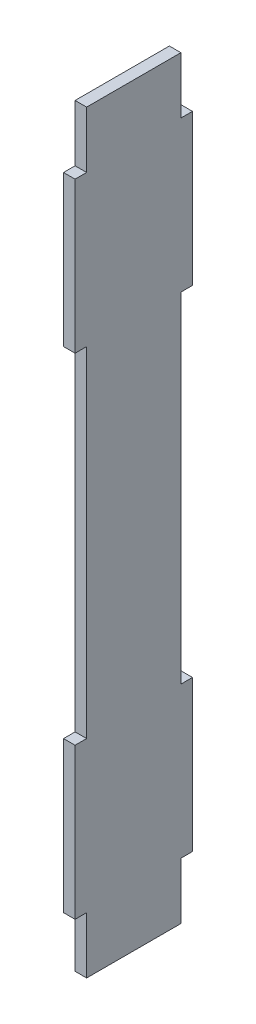
ISO-10303-21;
HEADER;
FILE_DESCRIPTION(('STEP AP214'),'2;1');
FILE_NAME('part.step','',(''),(''),'','','');
FILE_SCHEMA(('AUTOMOTIVE_DESIGN { 1 0 10303 214 1 1 1 1 }'));
ENDSEC;
DATA;
#1=APPLICATION_CONTEXT('core data for automotive mechanical design processes');
#2=APPLICATION_PROTOCOL_DEFINITION('international standard','automotive_design',2000,#1);
#3=PRODUCT_CONTEXT('',#1,'mechanical');
#4=PRODUCT('Part','Part','',(#3));
#5=PRODUCT_RELATED_PRODUCT_CATEGORY('part','',(#4));
#6=PRODUCT_DEFINITION_FORMATION('','',#4);
#7=PRODUCT_DEFINITION_CONTEXT('part definition',#1,'design');
#8=PRODUCT_DEFINITION('design','',#6,#7);
#9=PRODUCT_DEFINITION_SHAPE('','',#8);
#10=(LENGTH_UNIT() NAMED_UNIT(*) SI_UNIT(.MILLI.,.METRE.));
#11=(NAMED_UNIT(*) PLANE_ANGLE_UNIT() SI_UNIT($,.RADIAN.));
#12=(NAMED_UNIT(*) SI_UNIT($,.STERADIAN.) SOLID_ANGLE_UNIT());
#13=UNCERTAINTY_MEASURE_WITH_UNIT(LENGTH_MEASURE(1.E-05),#10,'distance_accuracy_value','');
#14=(GEOMETRIC_REPRESENTATION_CONTEXT(3) GLOBAL_UNCERTAINTY_ASSIGNED_CONTEXT((#13)) GLOBAL_UNIT_ASSIGNED_CONTEXT((#10,
#11,#12)) REPRESENTATION_CONTEXT('',''));
#15=CARTESIAN_POINT('',(0.,0.,0.));
#16=DIRECTION('',(0.,0.,1.));
#17=DIRECTION('',(1.,0.,0.));
#18=AXIS2_PLACEMENT_3D('',#15,#16,#17);
#19=CARTESIAN_POINT('',(-59.98,130.,-4.07));
#20=DIRECTION('',(0.,0.,-1.));
#21=DIRECTION('',(1.,0.,0.));
#22=AXIS2_PLACEMENT_3D('',#19,#20,#21);
#23=PLANE('',#22);
#24=DIRECTION('',(0.,-1.,0.));
#25=VECTOR('',#24,1.);
#26=CARTESIAN_POINT('',(-56.92,130.,-4.07));
#27=LINE('',#26,#25);
#28=CARTESIAN_POINT('',(-56.92,130.,-4.07));
#29=VERTEX_POINT('',#28);
#30=CARTESIAN_POINT('',(-56.92,114.99,-4.07));
#31=VERTEX_POINT('',#30);
#32=EDGE_CURVE('E211',#29,#31,#27,.T.);
#33=ORIENTED_EDGE('',*,*,#32,.F.);
#34=DIRECTION('',(1.,0.,0.));
#35=VECTOR('',#34,1.);
#36=CARTESIAN_POINT('',(-59.98,130.,-4.07));
#37=LINE('',#36,#35);
#38=CARTESIAN_POINT('',(-59.98,130.,-4.07));
#39=VERTEX_POINT('',#38);
#40=EDGE_CURVE('E210',#39,#29,#37,.T.);
#41=ORIENTED_EDGE('',*,*,#40,.F.);
#42=DIRECTION('',(0.,-1.,0.));
#43=VECTOR('',#42,1.);
#44=CARTESIAN_POINT('',(-59.98,130.,-4.07));
#45=LINE('',#44,#43);
#46=CARTESIAN_POINT('',(-59.98,114.99,-4.07));
#47=VERTEX_POINT('',#46);
#48=EDGE_CURVE('E265',#39,#47,#45,.T.);
#49=ORIENTED_EDGE('',*,*,#48,.T.);
#50=DIRECTION('',(1.,0.,0.));
#51=VECTOR('',#50,1.);
#52=CARTESIAN_POINT('',(-59.98,114.99,-4.07));
#53=LINE('',#52,#51);
#54=EDGE_CURVE('E11',#47,#31,#53,.T.);
#55=ORIENTED_EDGE('',*,*,#54,.T.);
#56=EDGE_LOOP('',(#33,#41,#49,#55));
#57=FACE_BOUND('',#56,.T.);
#58=ADVANCED_FACE('F43',(#57),#23,.F.);
#59=CARTESIAN_POINT('',(-59.98,114.99,-4.07));
#60=DIRECTION('',(0.,-1.,0.));
#61=DIRECTION('',(-1.,0.,0.));
#62=AXIS2_PLACEMENT_3D('',#59,#60,#61);
#63=PLANE('',#62);
#64=DIRECTION('',(0.,0.,1.));
#65=VECTOR('',#64,1.);
#66=CARTESIAN_POINT('',(-56.92,114.99,-4.07));
#67=LINE('',#66,#65);
#68=CARTESIAN_POINT('',(-56.92,114.99,-1.));
#69=VERTEX_POINT('',#68);
#70=EDGE_CURVE('E213',#31,#69,#67,.T.);
#71=ORIENTED_EDGE('',*,*,#70,.F.);
#72=ORIENTED_EDGE('',*,*,#54,.F.);
#73=DIRECTION('',(0.,0.,1.));
#74=VECTOR('',#73,1.);
#75=CARTESIAN_POINT('',(-59.98,114.99,-4.07));
#76=LINE('',#75,#74);
#77=CARTESIAN_POINT('',(-59.98,114.99,-1.));
#78=VERTEX_POINT('',#77);
#79=EDGE_CURVE('E133',#47,#78,#76,.T.);
#80=ORIENTED_EDGE('',*,*,#79,.T.);
#81=DIRECTION('',(1.,0.,0.));
#82=VECTOR('',#81,1.);
#83=CARTESIAN_POINT('',(-59.98,114.99,-1.));
#84=LINE('',#83,#82);
#85=EDGE_CURVE('E51',#78,#69,#84,.T.);
#86=ORIENTED_EDGE('',*,*,#85,.T.);
#87=EDGE_LOOP('',(#71,#72,#80,#86));
#88=FACE_BOUND('',#87,.T.);
#89=ADVANCED_FACE('F313',(#88),#63,.F.);
#90=CARTESIAN_POINT('',(-59.98,114.99,-1.));
#91=DIRECTION('',(0.,0.,-1.));
#92=DIRECTION('',(1.,0.,0.));
#93=AXIS2_PLACEMENT_3D('',#90,#91,#92);
#94=PLANE('',#93);
#95=DIRECTION('',(0.,-1.,0.));
#96=VECTOR('',#95,1.);
#97=CARTESIAN_POINT('',(-56.92,114.99,-1.));
#98=LINE('',#97,#96);
#99=CARTESIAN_POINT('',(-56.92,75.01,-1.));
#100=VERTEX_POINT('',#99);
#101=EDGE_CURVE('E216',#69,#100,#98,.T.);
#102=ORIENTED_EDGE('',*,*,#101,.F.);
#103=ORIENTED_EDGE('',*,*,#85,.F.);
#104=DIRECTION('',(0.,-1.,0.));
#105=VECTOR('',#104,1.);
#106=CARTESIAN_POINT('',(-59.98,114.99,-1.));
#107=LINE('',#106,#105);
#108=CARTESIAN_POINT('',(-59.98,75.01,-1.));
#109=VERTEX_POINT('',#108);
#110=EDGE_CURVE('E322',#78,#109,#107,.T.);
#111=ORIENTED_EDGE('',*,*,#110,.T.);
#112=DIRECTION('',(1.,0.,0.));
#113=VECTOR('',#112,1.);
#114=CARTESIAN_POINT('',(-59.98,75.01,-1.));
#115=LINE('',#114,#113);
#116=EDGE_CURVE('E308',#109,#100,#115,.T.);
#117=ORIENTED_EDGE('',*,*,#116,.T.);
#118=EDGE_LOOP('',(#102,#103,#111,#117));
#119=FACE_BOUND('',#118,.T.);
#120=ADVANCED_FACE('F404',(#119),#94,.F.);
#121=CARTESIAN_POINT('',(-59.98,75.01,-1.));
#122=DIRECTION('',(0.,1.,0.));
#123=DIRECTION('',(1.,0.,0.));
#124=AXIS2_PLACEMENT_3D('',#121,#122,#123);
#125=PLANE('',#124);
#126=DIRECTION('',(0.,0.,-1.));
#127=VECTOR('',#126,1.);
#128=CARTESIAN_POINT('',(-56.92,75.01,-1.));
#129=LINE('',#128,#127);
#130=CARTESIAN_POINT('',(-56.92,75.01,-4.07));
#131=VERTEX_POINT('',#130);
#132=EDGE_CURVE('E219',#100,#131,#129,.T.);
#133=ORIENTED_EDGE('',*,*,#132,.F.);
#134=ORIENTED_EDGE('',*,*,#116,.F.);
#135=DIRECTION('',(0.,0.,-1.));
#136=VECTOR('',#135,1.);
#137=CARTESIAN_POINT('',(-59.98,75.01,-1.));
#138=LINE('',#137,#136);
#139=CARTESIAN_POINT('',(-59.98,75.01,-4.07));
#140=VERTEX_POINT('',#139);
#141=EDGE_CURVE('E326',#109,#140,#138,.T.);
#142=ORIENTED_EDGE('',*,*,#141,.T.);
#143=DIRECTION('',(1.,0.,0.));
#144=VECTOR('',#143,1.);
#145=CARTESIAN_POINT('',(-59.98,75.01,-4.07));
#146=LINE('',#145,#144);
#147=EDGE_CURVE('E305',#140,#131,#146,.T.);
#148=ORIENTED_EDGE('',*,*,#147,.T.);
#149=EDGE_LOOP('',(#133,#134,#142,#148));
#150=FACE_BOUND('',#149,.T.);
#151=ADVANCED_FACE('F403',(#150),#125,.F.);
#152=CARTESIAN_POINT('',(-59.98,75.01,-4.07));
#153=DIRECTION('',(0.,0.,-1.));
#154=DIRECTION('',(0.,1.,0.));
#155=AXIS2_PLACEMENT_3D('',#152,#153,#154);
#156=PLANE('',#155);
#157=DIRECTION('',(0.,-1.,0.));
#158=VECTOR('',#157,1.);
#159=CARTESIAN_POINT('',(-56.92,75.01,-4.07));
#160=LINE('',#159,#158);
#161=CARTESIAN_POINT('',(-56.92,-15.01,-4.07000000000001));
#162=VERTEX_POINT('',#161);
#163=EDGE_CURVE('E222',#131,#162,#160,.T.);
#164=ORIENTED_EDGE('',*,*,#163,.F.);
#165=ORIENTED_EDGE('',*,*,#147,.F.);
#166=DIRECTION('',(0.,-1.,0.));
#167=VECTOR('',#166,1.);
#168=CARTESIAN_POINT('',(-59.98,75.01,-4.07));
#169=LINE('',#168,#167);
#170=CARTESIAN_POINT('',(-59.98,-15.01,-4.07000000000001));
#171=VERTEX_POINT('',#170);
#172=EDGE_CURVE('E329',#140,#171,#169,.T.);
#173=ORIENTED_EDGE('',*,*,#172,.T.);
#174=DIRECTION('',(1.,0.,0.));
#175=VECTOR('',#174,1.);
#176=CARTESIAN_POINT('',(-59.98,-15.01,-4.07000000000001));
#177=LINE('',#176,#175);
#178=EDGE_CURVE('E302',#171,#162,#177,.T.);
#179=ORIENTED_EDGE('',*,*,#178,.T.);
#180=EDGE_LOOP('',(#164,#165,#173,#179));
#181=FACE_BOUND('',#180,.T.);
#182=ADVANCED_FACE('F400',(#181),#156,.F.);
#183=CARTESIAN_POINT('',(-59.98,-15.01,-4.07000000000001));
#184=DIRECTION('',(0.,-1.,0.));
#185=DIRECTION('',(-1.,0.,0.));
#186=AXIS2_PLACEMENT_3D('',#183,#184,#185);
#187=PLANE('',#186);
#188=DIRECTION('',(0.,0.,1.));
#189=VECTOR('',#188,1.);
#190=CARTESIAN_POINT('',(-56.92,-15.01,-4.07000000000001));
#191=LINE('',#190,#189);
#192=CARTESIAN_POINT('',(-56.92,-15.01,-1.));
#193=VERTEX_POINT('',#192);
#194=EDGE_CURVE('E225',#162,#193,#191,.T.);
#195=ORIENTED_EDGE('',*,*,#194,.F.);
#196=ORIENTED_EDGE('',*,*,#178,.F.);
#197=DIRECTION('',(0.,0.,1.));
#198=VECTOR('',#197,1.);
#199=CARTESIAN_POINT('',(-59.98,-15.01,-4.07000000000001));
#200=LINE('',#199,#198);
#201=CARTESIAN_POINT('',(-59.98,-15.01,-1.));
#202=VERTEX_POINT('',#201);
#203=EDGE_CURVE('E332',#171,#202,#200,.T.);
#204=ORIENTED_EDGE('',*,*,#203,.T.);
#205=DIRECTION('',(1.,0.,0.));
#206=VECTOR('',#205,1.);
#207=CARTESIAN_POINT('',(-59.98,-15.01,-1.));
#208=LINE('',#207,#206);
#209=EDGE_CURVE('E299',#202,#193,#208,.T.);
#210=ORIENTED_EDGE('',*,*,#209,.T.);
#211=EDGE_LOOP('',(#195,#196,#204,#210));
#212=FACE_BOUND('',#211,.T.);
#213=ADVANCED_FACE('F397',(#212),#187,.F.);
#214=CARTESIAN_POINT('',(-59.98,-15.01,-1.));
#215=DIRECTION('',(0.,0.,-1.));
#216=DIRECTION('',(0.,1.,0.));
#217=AXIS2_PLACEMENT_3D('',#214,#215,#216);
#218=PLANE('',#217);
#219=DIRECTION('',(0.,-1.,0.));
#220=VECTOR('',#219,1.);
#221=CARTESIAN_POINT('',(-56.92,-15.01,-1.));
#222=LINE('',#221,#220);
#223=CARTESIAN_POINT('',(-56.92,-54.99,-1.));
#224=VERTEX_POINT('',#223);
#225=EDGE_CURVE('E228',#193,#224,#222,.T.);
#226=ORIENTED_EDGE('',*,*,#225,.F.);
#227=ORIENTED_EDGE('',*,*,#209,.F.);
#228=DIRECTION('',(0.,-1.,0.));
#229=VECTOR('',#228,1.);
#230=CARTESIAN_POINT('',(-59.98,-15.01,-1.));
#231=LINE('',#230,#229);
#232=CARTESIAN_POINT('',(-59.98,-54.99,-1.));
#233=VERTEX_POINT('',#232);
#234=EDGE_CURVE('E335',#202,#233,#231,.T.);
#235=ORIENTED_EDGE('',*,*,#234,.T.);
#236=DIRECTION('',(1.,0.,0.));
#237=VECTOR('',#236,1.);
#238=CARTESIAN_POINT('',(-59.98,-54.99,-1.));
#239=LINE('',#238,#237);
#240=EDGE_CURVE('E296',#233,#224,#239,.T.);
#241=ORIENTED_EDGE('',*,*,#240,.T.);
#242=EDGE_LOOP('',(#226,#227,#235,#241));
#243=FACE_BOUND('',#242,.T.);
#244=ADVANCED_FACE('F395',(#243),#218,.F.);
#245=CARTESIAN_POINT('',(-59.98,-54.99,-4.07000000000003));
#246=DIRECTION('',(0.,1.,0.));
#247=DIRECTION('',(1.,0.,0.));
#248=AXIS2_PLACEMENT_3D('',#245,#246,#247);
#249=PLANE('',#248);
#250=DIRECTION('',(0.,0.,-1.));
#251=VECTOR('',#250,1.);
#252=CARTESIAN_POINT('',(-56.92,-54.99,-4.07000000000003));
#253=LINE('',#252,#251);
#254=CARTESIAN_POINT('',(-56.92,-54.99,-4.07000000000003));
#255=VERTEX_POINT('',#254);
#256=EDGE_CURVE('E231',#224,#255,#253,.T.);
#257=ORIENTED_EDGE('',*,*,#256,.F.);
#258=ORIENTED_EDGE('',*,*,#240,.F.);
#259=DIRECTION('',(0.,0.,-1.));
#260=VECTOR('',#259,1.);
#261=CARTESIAN_POINT('',(-59.98,-54.99,-4.07000000000003));
#262=LINE('',#261,#260);
#263=CARTESIAN_POINT('',(-59.98,-54.99,-4.07000000000003));
#264=VERTEX_POINT('',#263);
#265=EDGE_CURVE('E338',#233,#264,#262,.T.);
#266=ORIENTED_EDGE('',*,*,#265,.T.);
#267=DIRECTION('',(1.,0.,0.));
#268=VECTOR('',#267,1.);
#269=CARTESIAN_POINT('',(-59.98,-54.99,-4.07000000000003));
#270=LINE('',#269,#268);
#271=EDGE_CURVE('E293',#264,#255,#270,.T.);
#272=ORIENTED_EDGE('',*,*,#271,.T.);
#273=EDGE_LOOP('',(#257,#258,#266,#272));
#274=FACE_BOUND('',#273,.T.);
#275=ADVANCED_FACE('F391',(#274),#249,.F.);
#276=CARTESIAN_POINT('',(-59.98,-54.99,-4.07000000000003));
#277=DIRECTION('',(0.,0.,-1.));
#278=DIRECTION('',(0.,1.,0.));
#279=AXIS2_PLACEMENT_3D('',#276,#277,#278);
#280=PLANE('',#279);
#281=DIRECTION('',(0.,-1.,0.));
#282=VECTOR('',#281,1.);
#283=CARTESIAN_POINT('',(-56.92,-54.99,-4.07000000000003));
#284=LINE('',#283,#282);
#285=CARTESIAN_POINT('',(-56.92,-70.,-4.07));
#286=VERTEX_POINT('',#285);
#287=EDGE_CURVE('E234',#255,#286,#284,.T.);
#288=ORIENTED_EDGE('',*,*,#287,.F.);
#289=ORIENTED_EDGE('',*,*,#271,.F.);
#290=DIRECTION('',(0.,-1.,0.));
#291=VECTOR('',#290,1.);
#292=CARTESIAN_POINT('',(-59.98,-54.99,-4.07000000000003));
#293=LINE('',#292,#291);
#294=CARTESIAN_POINT('',(-59.98,-70.,-4.07));
#295=VERTEX_POINT('',#294);
#296=EDGE_CURVE('E341',#264,#295,#293,.T.);
#297=ORIENTED_EDGE('',*,*,#296,.T.);
#298=DIRECTION('',(1.,0.,0.));
#299=VECTOR('',#298,1.);
#300=CARTESIAN_POINT('',(-59.98,-70.,-4.07));
#301=LINE('',#300,#299);
#302=EDGE_CURVE('E290',#295,#286,#301,.T.);
#303=ORIENTED_EDGE('',*,*,#302,.T.);
#304=EDGE_LOOP('',(#288,#289,#297,#303));
#305=FACE_BOUND('',#304,.T.);
#306=ADVANCED_FACE('F388',(#305),#280,.F.);
#307=CARTESIAN_POINT('',(-59.98,-70.,-4.07));
#308=DIRECTION('',(0.,1.,0.));
#309=DIRECTION('',(1.,0.,0.));
#310=AXIS2_PLACEMENT_3D('',#307,#308,#309);
#311=PLANE('',#310);
#312=DIRECTION('',(0.,0.,-1.));
#313=VECTOR('',#312,1.);
#314=CARTESIAN_POINT('',(-56.92,-70.,-4.07));
#315=LINE('',#314,#313);
#316=CARTESIAN_POINT('',(-56.92,-70.,-29.07));
#317=VERTEX_POINT('',#316);
#318=EDGE_CURVE('E237',#286,#317,#315,.T.);
#319=ORIENTED_EDGE('',*,*,#318,.F.);
#320=ORIENTED_EDGE('',*,*,#302,.F.);
#321=DIRECTION('',(0.,0.,-1.));
#322=VECTOR('',#321,1.);
#323=CARTESIAN_POINT('',(-59.98,-70.,-4.07));
#324=LINE('',#323,#322);
#325=CARTESIAN_POINT('',(-59.98,-70.,-29.07));
#326=VERTEX_POINT('',#325);
#327=EDGE_CURVE('E344',#295,#326,#324,.T.);
#328=ORIENTED_EDGE('',*,*,#327,.T.);
#329=DIRECTION('',(1.,0.,0.));
#330=VECTOR('',#329,1.);
#331=CARTESIAN_POINT('',(-59.98,-70.,-29.07));
#332=LINE('',#331,#330);
#333=EDGE_CURVE('E287',#326,#317,#332,.T.);
#334=ORIENTED_EDGE('',*,*,#333,.T.);
#335=EDGE_LOOP('',(#319,#320,#328,#334));
#336=FACE_BOUND('',#335,.T.);
#337=ADVANCED_FACE('F386',(#336),#311,.F.);
#338=CARTESIAN_POINT('',(-59.98,-70.,-29.07));
#339=DIRECTION('',(0.,0.,1.));
#340=DIRECTION('',(0.,-1.,0.));
#341=AXIS2_PLACEMENT_3D('',#338,#339,#340);
#342=PLANE('',#341);
#343=DIRECTION('',(0.,1.,0.));
#344=VECTOR('',#343,1.);
#345=CARTESIAN_POINT('',(-56.92,-70.,-29.07));
#346=LINE('',#345,#344);
#347=CARTESIAN_POINT('',(-56.92,-54.99,-29.07));
#348=VERTEX_POINT('',#347);
#349=EDGE_CURVE('E240',#317,#348,#346,.T.);
#350=ORIENTED_EDGE('',*,*,#349,.F.);
#351=ORIENTED_EDGE('',*,*,#333,.F.);
#352=DIRECTION('',(0.,1.,0.));
#353=VECTOR('',#352,1.);
#354=CARTESIAN_POINT('',(-59.98,-70.,-29.07));
#355=LINE('',#354,#353);
#356=CARTESIAN_POINT('',(-59.98,-54.99,-29.07));
#357=VERTEX_POINT('',#356);
#358=EDGE_CURVE('E347',#326,#357,#355,.T.);
#359=ORIENTED_EDGE('',*,*,#358,.T.);
#360=DIRECTION('',(1.,0.,0.));
#361=VECTOR('',#360,1.);
#362=CARTESIAN_POINT('',(-59.98,-54.99,-29.07));
#363=LINE('',#362,#361);
#364=EDGE_CURVE('E284',#357,#348,#363,.T.);
#365=ORIENTED_EDGE('',*,*,#364,.T.);
#366=EDGE_LOOP('',(#350,#351,#359,#365));
#367=FACE_BOUND('',#366,.T.);
#368=ADVANCED_FACE('F382',(#367),#342,.F.);
#369=CARTESIAN_POINT('',(-59.98,-54.99,-29.07));
#370=DIRECTION('',(0.,1.,0.));
#371=DIRECTION('',(1.,0.,0.));
#372=AXIS2_PLACEMENT_3D('',#369,#370,#371);
#373=PLANE('',#372);
#374=DIRECTION('',(0.,0.,-1.));
#375=VECTOR('',#374,1.);
#376=CARTESIAN_POINT('',(-56.92,-54.99,-29.07));
#377=LINE('',#376,#375);
#378=CARTESIAN_POINT('',(-56.92,-54.99,-32.14));
#379=VERTEX_POINT('',#378);
#380=EDGE_CURVE('E243',#348,#379,#377,.T.);
#381=ORIENTED_EDGE('',*,*,#380,.F.);
#382=ORIENTED_EDGE('',*,*,#364,.F.);
#383=DIRECTION('',(0.,0.,-1.));
#384=VECTOR('',#383,1.);
#385=CARTESIAN_POINT('',(-59.98,-54.99,-29.07));
#386=LINE('',#385,#384);
#387=CARTESIAN_POINT('',(-59.98,-54.99,-32.14));
#388=VERTEX_POINT('',#387);
#389=EDGE_CURVE('E350',#357,#388,#386,.T.);
#390=ORIENTED_EDGE('',*,*,#389,.T.);
#391=DIRECTION('',(1.,0.,0.));
#392=VECTOR('',#391,1.);
#393=CARTESIAN_POINT('',(-59.98,-54.99,-32.14));
#394=LINE('',#393,#392);
#395=EDGE_CURVE('E281',#388,#379,#394,.T.);
#396=ORIENTED_EDGE('',*,*,#395,.T.);
#397=EDGE_LOOP('',(#381,#382,#390,#396));
#398=FACE_BOUND('',#397,.T.);
#399=ADVANCED_FACE('F379',(#398),#373,.F.);
#400=CARTESIAN_POINT('',(-59.98,-15.01,-32.14));
#401=DIRECTION('',(0.,0.,1.));
#402=DIRECTION('',(-1.,0.,0.));
#403=AXIS2_PLACEMENT_3D('',#400,#401,#402);
#404=PLANE('',#403);
#405=DIRECTION('',(0.,1.,0.));
#406=VECTOR('',#405,1.);
#407=CARTESIAN_POINT('',(-56.92,-15.01,-32.14));
#408=LINE('',#407,#406);
#409=CARTESIAN_POINT('',(-56.92,-15.01,-32.14));
#410=VERTEX_POINT('',#409);
#411=EDGE_CURVE('E246',#379,#410,#408,.T.);
#412=ORIENTED_EDGE('',*,*,#411,.F.);
#413=ORIENTED_EDGE('',*,*,#395,.F.);
#414=DIRECTION('',(0.,1.,0.));
#415=VECTOR('',#414,1.);
#416=CARTESIAN_POINT('',(-59.98,-15.01,-32.14));
#417=LINE('',#416,#415);
#418=CARTESIAN_POINT('',(-59.98,-15.01,-32.14));
#419=VERTEX_POINT('',#418);
#420=EDGE_CURVE('E353',#388,#419,#417,.T.);
#421=ORIENTED_EDGE('',*,*,#420,.T.);
#422=DIRECTION('',(1.,0.,0.));
#423=VECTOR('',#422,1.);
#424=CARTESIAN_POINT('',(-59.98,-15.01,-32.14));
#425=LINE('',#424,#423);
#426=EDGE_CURVE('E278',#419,#410,#425,.T.);
#427=ORIENTED_EDGE('',*,*,#426,.T.);
#428=EDGE_LOOP('',(#412,#413,#421,#427));
#429=FACE_BOUND('',#428,.T.);
#430=ADVANCED_FACE('F377',(#429),#404,.F.);
#431=CARTESIAN_POINT('',(-59.98,-15.01,-29.07));
#432=DIRECTION('',(0.,-1.,0.));
#433=DIRECTION('',(-1.,0.,0.));
#434=AXIS2_PLACEMENT_3D('',#431,#432,#433);
#435=PLANE('',#434);
#436=DIRECTION('',(0.,0.,1.));
#437=VECTOR('',#436,1.);
#438=CARTESIAN_POINT('',(-56.92,-15.01,-29.07));
#439=LINE('',#438,#437);
#440=CARTESIAN_POINT('',(-56.92,-15.01,-29.07));
#441=VERTEX_POINT('',#440);
#442=EDGE_CURVE('E249',#410,#441,#439,.T.);
#443=ORIENTED_EDGE('',*,*,#442,.F.);
#444=ORIENTED_EDGE('',*,*,#426,.F.);
#445=DIRECTION('',(0.,0.,1.));
#446=VECTOR('',#445,1.);
#447=CARTESIAN_POINT('',(-59.98,-15.01,-29.07));
#448=LINE('',#447,#446);
#449=CARTESIAN_POINT('',(-59.98,-15.01,-29.07));
#450=VERTEX_POINT('',#449);
#451=EDGE_CURVE('E356',#419,#450,#448,.T.);
#452=ORIENTED_EDGE('',*,*,#451,.T.);
#453=DIRECTION('',(1.,0.,0.));
#454=VECTOR('',#453,1.);
#455=CARTESIAN_POINT('',(-59.98,-15.01,-29.07));
#456=LINE('',#455,#454);
#457=EDGE_CURVE('E275',#450,#441,#456,.T.);
#458=ORIENTED_EDGE('',*,*,#457,.T.);
#459=EDGE_LOOP('',(#443,#444,#452,#458));
#460=FACE_BOUND('',#459,.T.);
#461=ADVANCED_FACE('F373',(#460),#435,.F.);
#462=CARTESIAN_POINT('',(-59.98,-15.01,-29.07));
#463=DIRECTION('',(0.,0.,1.));
#464=DIRECTION('',(0.,-1.,0.));
#465=AXIS2_PLACEMENT_3D('',#462,#463,#464);
#466=PLANE('',#465);
#467=DIRECTION('',(0.,1.,0.));
#468=VECTOR('',#467,1.);
#469=CARTESIAN_POINT('',(-56.92,-15.01,-29.07));
#470=LINE('',#469,#468);
#471=CARTESIAN_POINT('',(-56.92,75.01,-29.07));
#472=VERTEX_POINT('',#471);
#473=EDGE_CURVE('E252',#441,#472,#470,.T.);
#474=ORIENTED_EDGE('',*,*,#473,.F.);
#475=ORIENTED_EDGE('',*,*,#457,.F.);
#476=DIRECTION('',(0.,1.,0.));
#477=VECTOR('',#476,1.);
#478=CARTESIAN_POINT('',(-59.98,-15.01,-29.07));
#479=LINE('',#478,#477);
#480=CARTESIAN_POINT('',(-59.98,75.01,-29.07));
#481=VERTEX_POINT('',#480);
#482=EDGE_CURVE('E359',#450,#481,#479,.T.);
#483=ORIENTED_EDGE('',*,*,#482,.T.);
#484=DIRECTION('',(1.,0.,0.));
#485=VECTOR('',#484,1.);
#486=CARTESIAN_POINT('',(-59.98,75.01,-29.07));
#487=LINE('',#486,#485);
#488=EDGE_CURVE('E272',#481,#472,#487,.T.);
#489=ORIENTED_EDGE('',*,*,#488,.T.);
#490=EDGE_LOOP('',(#474,#475,#483,#489));
#491=FACE_BOUND('',#490,.T.);
#492=ADVANCED_FACE('F370',(#491),#466,.F.);
#493=CARTESIAN_POINT('',(-59.98,75.01,-32.14));
#494=DIRECTION('',(0.,1.,0.));
#495=DIRECTION('',(1.,0.,0.));
#496=AXIS2_PLACEMENT_3D('',#493,#494,#495);
#497=PLANE('',#496);
#498=DIRECTION('',(0.,0.,-1.));
#499=VECTOR('',#498,1.);
#500=CARTESIAN_POINT('',(-56.92,75.01,-32.14));
#501=LINE('',#500,#499);
#502=CARTESIAN_POINT('',(-56.92,75.01,-32.14));
#503=VERTEX_POINT('',#502);
#504=EDGE_CURVE('E255',#472,#503,#501,.T.);
#505=ORIENTED_EDGE('',*,*,#504,.F.);
#506=ORIENTED_EDGE('',*,*,#488,.F.);
#507=DIRECTION('',(0.,0.,-1.));
#508=VECTOR('',#507,1.);
#509=CARTESIAN_POINT('',(-59.98,75.01,-32.14));
#510=LINE('',#509,#508);
#511=CARTESIAN_POINT('',(-59.98,75.01,-32.14));
#512=VERTEX_POINT('',#511);
#513=EDGE_CURVE('E205',#481,#512,#510,.T.);
#514=ORIENTED_EDGE('',*,*,#513,.T.);
#515=DIRECTION('',(1.,0.,0.));
#516=VECTOR('',#515,1.);
#517=CARTESIAN_POINT('',(-59.98,75.01,-32.14));
#518=LINE('',#517,#516);
#519=EDGE_CURVE('E269',#512,#503,#518,.T.);
#520=ORIENTED_EDGE('',*,*,#519,.T.);
#521=EDGE_LOOP('',(#505,#506,#514,#520));
#522=FACE_BOUND('',#521,.T.);
#523=ADVANCED_FACE('F364',(#522),#497,.F.);
#524=CARTESIAN_POINT('',(-59.98,114.99,-32.14));
#525=DIRECTION('',(0.,0.,1.));
#526=DIRECTION('',(-1.,0.,0.));
#527=AXIS2_PLACEMENT_3D('',#524,#525,#526);
#528=PLANE('',#527);
#529=DIRECTION('',(0.,1.,0.));
#530=VECTOR('',#529,1.);
#531=CARTESIAN_POINT('',(-56.92,114.99,-32.14));
#532=LINE('',#531,#530);
#533=CARTESIAN_POINT('',(-56.92,114.99,-32.14));
#534=VERTEX_POINT('',#533);
#535=EDGE_CURVE('E258',#503,#534,#532,.T.);
#536=ORIENTED_EDGE('',*,*,#535,.F.);
#537=ORIENTED_EDGE('',*,*,#519,.F.);
#538=DIRECTION('',(0.,1.,0.));
#539=VECTOR('',#538,1.);
#540=CARTESIAN_POINT('',(-59.98,114.99,-32.14));
#541=LINE('',#540,#539);
#542=CARTESIAN_POINT('',(-59.98,114.99,-32.14));
#543=VERTEX_POINT('',#542);
#544=EDGE_CURVE('E203',#512,#543,#541,.T.);
#545=ORIENTED_EDGE('',*,*,#544,.T.);
#546=DIRECTION('',(1.,0.,0.));
#547=VECTOR('',#546,1.);
#548=CARTESIAN_POINT('',(-59.98,114.99,-32.14));
#549=LINE('',#548,#547);
#550=EDGE_CURVE('E197',#543,#534,#549,.T.);
#551=ORIENTED_EDGE('',*,*,#550,.T.);
#552=EDGE_LOOP('',(#536,#537,#545,#551));
#553=FACE_BOUND('',#552,.T.);
#554=ADVANCED_FACE('F368',(#553),#528,.F.);
#555=CARTESIAN_POINT('',(-59.98,114.99,-29.07));
#556=DIRECTION('',(0.,-1.,0.));
#557=DIRECTION('',(-1.,0.,0.));
#558=AXIS2_PLACEMENT_3D('',#555,#556,#557);
#559=PLANE('',#558);
#560=DIRECTION('',(0.,0.,1.));
#561=VECTOR('',#560,1.);
#562=CARTESIAN_POINT('',(-56.92,114.99,-29.07));
#563=LINE('',#562,#561);
#564=CARTESIAN_POINT('',(-56.92,114.99,-29.07));
#565=VERTEX_POINT('',#564);
#566=EDGE_CURVE('E261',#534,#565,#563,.T.);
#567=ORIENTED_EDGE('',*,*,#566,.F.);
#568=ORIENTED_EDGE('',*,*,#550,.F.);
#569=DIRECTION('',(0.,0.,1.));
#570=VECTOR('',#569,1.);
#571=CARTESIAN_POINT('',(-59.98,114.99,-29.07));
#572=LINE('',#571,#570);
#573=CARTESIAN_POINT('',(-59.98,114.99,-29.07));
#574=VERTEX_POINT('',#573);
#575=EDGE_CURVE('E187',#543,#574,#572,.T.);
#576=ORIENTED_EDGE('',*,*,#575,.T.);
#577=DIRECTION('',(1.,0.,0.));
#578=VECTOR('',#577,1.);
#579=CARTESIAN_POINT('',(-59.98,114.99,-29.07));
#580=LINE('',#579,#578);
#581=EDGE_CURVE('E192',#574,#565,#580,.T.);
#582=ORIENTED_EDGE('',*,*,#581,.T.);
#583=EDGE_LOOP('',(#567,#568,#576,#582));
#584=FACE_BOUND('',#583,.T.);
#585=ADVANCED_FACE('F200',(#584),#559,.F.);
#586=CARTESIAN_POINT('',(-59.98,114.99,-29.07));
#587=DIRECTION('',(0.,0.,1.));
#588=DIRECTION('',(-1.,0.,0.));
#589=AXIS2_PLACEMENT_3D('',#586,#587,#588);
#590=PLANE('',#589);
#591=DIRECTION('',(0.,1.,0.));
#592=VECTOR('',#591,1.);
#593=CARTESIAN_POINT('',(-56.92,114.99,-29.07));
#594=LINE('',#593,#592);
#595=CARTESIAN_POINT('',(-56.92,130.,-29.07));
#596=VERTEX_POINT('',#595);
#597=EDGE_CURVE('E194',#565,#596,#594,.T.);
#598=ORIENTED_EDGE('',*,*,#597,.F.);
#599=ORIENTED_EDGE('',*,*,#581,.F.);
#600=DIRECTION('',(0.,1.,0.));
#601=VECTOR('',#600,1.);
#602=CARTESIAN_POINT('',(-59.98,114.99,-29.07));
#603=LINE('',#602,#601);
#604=CARTESIAN_POINT('',(-59.98,130.,-29.07));
#605=VERTEX_POINT('',#604);
#606=EDGE_CURVE('E183',#574,#605,#603,.T.);
#607=ORIENTED_EDGE('',*,*,#606,.T.);
#608=DIRECTION('',(1.,0.,0.));
#609=VECTOR('',#608,1.);
#610=CARTESIAN_POINT('',(-59.98,130.,-29.07));
#611=LINE('',#610,#609);
#612=EDGE_CURVE('E198',#605,#596,#611,.T.);
#613=ORIENTED_EDGE('',*,*,#612,.T.);
#614=EDGE_LOOP('',(#598,#599,#607,#613));
#615=FACE_BOUND('',#614,.T.);
#616=ADVANCED_FACE('F193',(#615),#590,.F.);
#617=CARTESIAN_POINT('',(-59.98,130.,-29.07));
#618=DIRECTION('',(0.,-1.,0.));
#619=DIRECTION('',(-1.,0.,0.));
#620=AXIS2_PLACEMENT_3D('',#617,#618,#619);
#621=PLANE('',#620);
#622=DIRECTION('',(0.,0.,1.));
#623=VECTOR('',#622,1.);
#624=CARTESIAN_POINT('',(-56.92,130.,-29.07));
#625=LINE('',#624,#623);
#626=EDGE_CURVE('E121',#596,#29,#625,.T.);
#627=ORIENTED_EDGE('',*,*,#626,.F.);
#628=ORIENTED_EDGE('',*,*,#612,.F.);
#629=DIRECTION('',(0.,0.,1.));
#630=VECTOR('',#629,1.);
#631=CARTESIAN_POINT('',(-59.98,130.,-29.07));
#632=LINE('',#631,#630);
#633=EDGE_CURVE('E59',#605,#39,#632,.T.);
#634=ORIENTED_EDGE('',*,*,#633,.T.);
#635=ORIENTED_EDGE('',*,*,#40,.T.);
#636=EDGE_LOOP('',(#627,#628,#634,#635));
#637=FACE_BOUND('',#636,.T.);
#638=ADVANCED_FACE('F537',(#637),#621,.F.);
#639=CARTESIAN_POINT('',(-59.98,0.,0.));
#640=DIRECTION('',(1.,0.,0.));
#641=DIRECTION('',(0.,0.,1.));
#642=AXIS2_PLACEMENT_3D('',#639,#640,#641);
#643=PLANE('',#642);
#644=ORIENTED_EDGE('',*,*,#48,.F.);
#645=ORIENTED_EDGE('',*,*,#633,.F.);
#646=ORIENTED_EDGE('',*,*,#606,.F.);
#647=ORIENTED_EDGE('',*,*,#575,.F.);
#648=ORIENTED_EDGE('',*,*,#544,.F.);
#649=ORIENTED_EDGE('',*,*,#513,.F.);
#650=ORIENTED_EDGE('',*,*,#482,.F.);
#651=ORIENTED_EDGE('',*,*,#451,.F.);
#652=ORIENTED_EDGE('',*,*,#420,.F.);
#653=ORIENTED_EDGE('',*,*,#389,.F.);
#654=ORIENTED_EDGE('',*,*,#358,.F.);
#655=ORIENTED_EDGE('',*,*,#327,.F.);
#656=ORIENTED_EDGE('',*,*,#296,.F.);
#657=ORIENTED_EDGE('',*,*,#265,.F.);
#658=ORIENTED_EDGE('',*,*,#234,.F.);
#659=ORIENTED_EDGE('',*,*,#203,.F.);
#660=ORIENTED_EDGE('',*,*,#172,.F.);
#661=ORIENTED_EDGE('',*,*,#141,.F.);
#662=ORIENTED_EDGE('',*,*,#110,.F.);
#663=ORIENTED_EDGE('',*,*,#79,.F.);
#664=EDGE_LOOP('',(#644,#645,#646,#647,#648,#649,#650,#651,#652,#653,#654,#655,#656,#657,#658,
#659,#660,#661,#662,#663));
#665=FACE_BOUND('',#664,.T.);
#666=ADVANCED_FACE('F185',(#665),#643,.F.);
#667=CARTESIAN_POINT('',(-56.92,0.,0.));
#668=DIRECTION('',(1.,0.,0.));
#669=DIRECTION('',(0.,0.,1.));
#670=AXIS2_PLACEMENT_3D('',#667,#668,#669);
#671=PLANE('',#670);
#672=ORIENTED_EDGE('',*,*,#32,.T.);
#673=ORIENTED_EDGE('',*,*,#70,.T.);
#674=ORIENTED_EDGE('',*,*,#101,.T.);
#675=ORIENTED_EDGE('',*,*,#132,.T.);
#676=ORIENTED_EDGE('',*,*,#163,.T.);
#677=ORIENTED_EDGE('',*,*,#194,.T.);
#678=ORIENTED_EDGE('',*,*,#225,.T.);
#679=ORIENTED_EDGE('',*,*,#256,.T.);
#680=ORIENTED_EDGE('',*,*,#287,.T.);
#681=ORIENTED_EDGE('',*,*,#318,.T.);
#682=ORIENTED_EDGE('',*,*,#349,.T.);
#683=ORIENTED_EDGE('',*,*,#380,.T.);
#684=ORIENTED_EDGE('',*,*,#411,.T.);
#685=ORIENTED_EDGE('',*,*,#442,.T.);
#686=ORIENTED_EDGE('',*,*,#473,.T.);
#687=ORIENTED_EDGE('',*,*,#504,.T.);
#688=ORIENTED_EDGE('',*,*,#535,.T.);
#689=ORIENTED_EDGE('',*,*,#566,.T.);
#690=ORIENTED_EDGE('',*,*,#597,.T.);
#691=ORIENTED_EDGE('',*,*,#626,.T.);
#692=EDGE_LOOP('',(#672,#673,#674,#675,#676,#677,#678,#679,#680,#681,#682,#683,#684,#685,#686,
#687,#688,#689,#690,#691));
#693=FACE_BOUND('',#692,.T.);
#694=ADVANCED_FACE('F316',(#693),#671,.T.);
#695=CLOSED_SHELL('',(#58,#89,#120,#151,#182,#213,#244,#275,#306,#337,#368,#399,#430,#461,#492,
#523,#554,#585,#616,#638,#666,#694));
#696=MANIFOLD_SOLID_BREP('B2',#695);
#697=ADVANCED_BREP_SHAPE_REPRESENTATION('',(#18,#696),#14);
#698=SHAPE_DEFINITION_REPRESENTATION(#9,#697);
ENDSEC;
END-ISO-10303-21;
